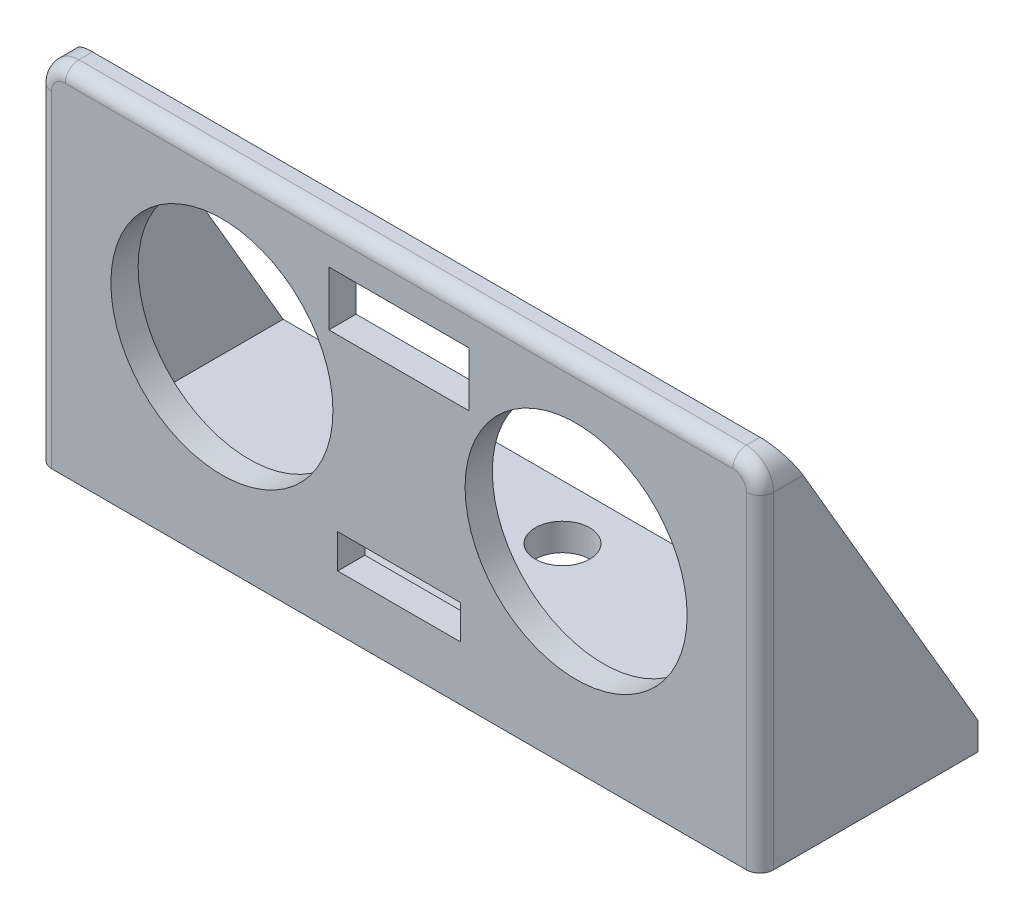
ISO-10303-21;
HEADER;
FILE_DESCRIPTION(('STEP AP214'),'2;1');
FILE_NAME('part.step','',(''),(''),'','','');
FILE_SCHEMA(('AUTOMOTIVE_DESIGN { 1 0 10303 214 1 1 1 1 }'));
ENDSEC;
DATA;
#1=APPLICATION_CONTEXT('core data for automotive mechanical design processes');
#2=APPLICATION_PROTOCOL_DEFINITION('international standard','automotive_design',2000,#1);
#3=PRODUCT_CONTEXT('',#1,'mechanical');
#4=PRODUCT('Part','Part','',(#3));
#5=PRODUCT_RELATED_PRODUCT_CATEGORY('part','',(#4));
#6=PRODUCT_DEFINITION_FORMATION('','',#4);
#7=PRODUCT_DEFINITION_CONTEXT('part definition',#1,'design');
#8=PRODUCT_DEFINITION('design','',#6,#7);
#9=PRODUCT_DEFINITION_SHAPE('','',#8);
#10=(LENGTH_UNIT() NAMED_UNIT(*) SI_UNIT(.MILLI.,.METRE.));
#11=(NAMED_UNIT(*) PLANE_ANGLE_UNIT() SI_UNIT($,.RADIAN.));
#12=(NAMED_UNIT(*) SI_UNIT($,.STERADIAN.) SOLID_ANGLE_UNIT());
#13=UNCERTAINTY_MEASURE_WITH_UNIT(LENGTH_MEASURE(1.E-05),#10,'distance_accuracy_value','');
#14=(GEOMETRIC_REPRESENTATION_CONTEXT(3) GLOBAL_UNCERTAINTY_ASSIGNED_CONTEXT((#13)) GLOBAL_UNIT_ASSIGNED_CONTEXT((#10,
#11,#12)) REPRESENTATION_CONTEXT('',''));
#15=CARTESIAN_POINT('',(0.,0.,0.));
#16=DIRECTION('',(0.,0.,1.));
#17=DIRECTION('',(1.,0.,0.));
#18=AXIS2_PLACEMENT_3D('',#15,#16,#17);
#19=CARTESIAN_POINT('',(0.,0.,2.));
#20=DIRECTION('',(0.,0.,-1.));
#21=DIRECTION('',(-1.,0.,0.));
#22=AXIS2_PLACEMENT_3D('',#19,#20,#21);
#23=PLANE('',#22);
#24=DIRECTION('',(1.,0.,0.));
#25=VECTOR('',#24,1.);
#26=CARTESIAN_POINT('',(0.,-2.,2.));
#27=LINE('',#26,#25);
#28=CARTESIAN_POINT('',(1.,-2.,2.));
#29=VERTEX_POINT('',#28);
#30=CARTESIAN_POINT('',(52.,-2.,2.));
#31=VERTEX_POINT('',#30);
#32=EDGE_CURVE('E198',#29,#31,#27,.T.);
#33=ORIENTED_EDGE('',*,*,#32,.T.);
#34=DIRECTION('',(0.,1.,0.));
#35=VECTOR('',#34,1.);
#36=CARTESIAN_POINT('',(52.,0.,2.));
#37=LINE('',#36,#35);
#38=CARTESIAN_POINT('',(52.,22.,2.));
#39=VERTEX_POINT('',#38);
#40=EDGE_CURVE('E406',#31,#39,#37,.T.);
#41=ORIENTED_EDGE('',*,*,#40,.T.);
#42=CARTESIAN_POINT('',(51.,22.,2.));
#43=DIRECTION('',(0.,0.,-1.));
#44=DIRECTION('',(-1.,0.,0.));
#45=AXIS2_PLACEMENT_3D('',#42,#43,#44);
#46=CIRCLE('',#45,1.);
#47=CARTESIAN_POINT('',(51.,23.,2.));
#48=VERTEX_POINT('',#47);
#49=EDGE_CURVE('E403',#39,#48,#46,.F.);
#50=ORIENTED_EDGE('',*,*,#49,.T.);
#51=DIRECTION('',(-1.,0.,0.));
#52=VECTOR('',#51,1.);
#53=CARTESIAN_POINT('',(0.,23.,2.));
#54=LINE('',#53,#52);
#55=CARTESIAN_POINT('',(2.,23.,2.));
#56=VERTEX_POINT('',#55);
#57=EDGE_CURVE('E394',#48,#56,#54,.T.);
#58=ORIENTED_EDGE('',*,*,#57,.T.);
#59=CARTESIAN_POINT('',(2.,22.,2.));
#60=DIRECTION('',(0.,0.,-1.));
#61=DIRECTION('',(-1.,0.,0.));
#62=AXIS2_PLACEMENT_3D('',#59,#60,#61);
#63=CIRCLE('',#62,1.);
#64=CARTESIAN_POINT('',(1.,22.,2.));
#65=VERTEX_POINT('',#64);
#66=EDGE_CURVE('E397',#56,#65,#63,.F.);
#67=ORIENTED_EDGE('',*,*,#66,.T.);
#68=DIRECTION('',(0.,-1.,0.));
#69=VECTOR('',#68,1.);
#70=CARTESIAN_POINT('',(1.,0.,2.));
#71=LINE('',#70,#69);
#72=EDGE_CURVE('E400',#65,#29,#71,.T.);
#73=ORIENTED_EDGE('',*,*,#72,.T.);
#74=EDGE_LOOP('',(#33,#41,#50,#58,#67,#73));
#75=FACE_BOUND('',#74,.T.);
#76=DIRECTION('',(0.,-1.,0.));
#77=VECTOR('',#76,1.);
#78=CARTESIAN_POINT('',(21.35,21.,2.));
#79=LINE('',#78,#77);
#80=CARTESIAN_POINT('',(21.35,21.,2.));
#81=VERTEX_POINT('',#80);
#82=CARTESIAN_POINT('',(21.35,17.,2.));
#83=VERTEX_POINT('',#82);
#84=EDGE_CURVE('E311',#81,#83,#79,.T.);
#85=ORIENTED_EDGE('',*,*,#84,.F.);
#86=DIRECTION('',(-1.,0.,0.));
#87=VECTOR('',#86,1.);
#88=CARTESIAN_POINT('',(21.35,21.,2.));
#89=LINE('',#88,#87);
#90=CARTESIAN_POINT('',(31.65,21.,2.));
#91=VERTEX_POINT('',#90);
#92=EDGE_CURVE('E322',#91,#81,#89,.T.);
#93=ORIENTED_EDGE('',*,*,#92,.F.);
#94=DIRECTION('',(0.,1.,0.));
#95=VECTOR('',#94,1.);
#96=CARTESIAN_POINT('',(31.65,21.,2.));
#97=LINE('',#96,#95);
#98=CARTESIAN_POINT('',(31.65,17.,2.));
#99=VERTEX_POINT('',#98);
#100=EDGE_CURVE('E318',#99,#91,#97,.T.);
#101=ORIENTED_EDGE('',*,*,#100,.F.);
#102=DIRECTION('',(1.,0.,0.));
#103=VECTOR('',#102,1.);
#104=CARTESIAN_POINT('',(21.35,17.,2.));
#105=LINE('',#104,#103);
#106=EDGE_CURVE('E314',#83,#99,#105,.T.);
#107=ORIENTED_EDGE('',*,*,#106,.F.);
#108=EDGE_LOOP('',(#85,#93,#101,#107));
#109=FACE_BOUND('',#108,.T.);
#110=CARTESIAN_POINT('',(13.5,12.,2.));
#111=DIRECTION('',(0.,0.,1.));
#112=DIRECTION('',(1.,0.,0.));
#113=AXIS2_PLACEMENT_3D('',#110,#111,#112);
#114=CIRCLE('',#113,8.14999999999999);
#115=CARTESIAN_POINT('',(21.65,12.,2.));
#116=VERTEX_POINT('',#115);
#117=EDGE_CURVE('E362',#116,#116,#114,.T.);
#118=ORIENTED_EDGE('',*,*,#117,.F.);
#119=EDGE_LOOP('',(#118));
#120=FACE_BOUND('',#119,.T.);
#121=CARTESIAN_POINT('',(39.5,12.,2.));
#122=DIRECTION('',(0.,0.,1.));
#123=DIRECTION('',(1.,0.,0.));
#124=AXIS2_PLACEMENT_3D('',#121,#122,#123);
#125=CIRCLE('',#124,8.15);
#126=CARTESIAN_POINT('',(47.65,12.,2.));
#127=VERTEX_POINT('',#126);
#128=EDGE_CURVE('E354',#127,#127,#125,.T.);
#129=ORIENTED_EDGE('',*,*,#128,.F.);
#130=EDGE_LOOP('',(#129));
#131=FACE_BOUND('',#130,.T.);
#132=DIRECTION('',(0.,-1.,0.));
#133=VECTOR('',#132,1.);
#134=CARTESIAN_POINT('',(22.,4.5,2.));
#135=LINE('',#134,#133);
#136=CARTESIAN_POINT('',(22.,4.5,2.));
#137=VERTEX_POINT('',#136);
#138=CARTESIAN_POINT('',(22.,2.,2.));
#139=VERTEX_POINT('',#138);
#140=EDGE_CURVE('E268',#137,#139,#135,.T.);
#141=ORIENTED_EDGE('',*,*,#140,.F.);
#142=DIRECTION('',(-1.,0.,0.));
#143=VECTOR('',#142,1.);
#144=CARTESIAN_POINT('',(22.,4.5,2.));
#145=LINE('',#144,#143);
#146=CARTESIAN_POINT('',(31.,4.5,2.));
#147=VERTEX_POINT('',#146);
#148=EDGE_CURVE('E279',#147,#137,#145,.T.);
#149=ORIENTED_EDGE('',*,*,#148,.F.);
#150=DIRECTION('',(0.,1.,0.));
#151=VECTOR('',#150,1.);
#152=CARTESIAN_POINT('',(31.,4.5,2.));
#153=LINE('',#152,#151);
#154=CARTESIAN_POINT('',(31.,2.,2.));
#155=VERTEX_POINT('',#154);
#156=EDGE_CURVE('E275',#155,#147,#153,.T.);
#157=ORIENTED_EDGE('',*,*,#156,.F.);
#158=DIRECTION('',(1.,0.,0.));
#159=VECTOR('',#158,1.);
#160=CARTESIAN_POINT('',(22.,2.,2.));
#161=LINE('',#160,#159);
#162=EDGE_CURVE('E271',#139,#155,#161,.T.);
#163=ORIENTED_EDGE('',*,*,#162,.F.);
#164=EDGE_LOOP('',(#141,#149,#157,#163));
#165=FACE_BOUND('',#164,.T.);
#166=ADVANCED_FACE('F49',(#75,#109,#120,#131,#165),#23,.F.);
#167=CARTESIAN_POINT('',(0.,0.,0.));
#168=DIRECTION('',(0.,0.,-1.));
#169=DIRECTION('',(-1.,0.,0.));
#170=AXIS2_PLACEMENT_3D('',#167,#168,#169);
#171=PLANE('',#170);
#172=DIRECTION('',(0.,-1.,0.));
#173=VECTOR('',#172,1.);
#174=CARTESIAN_POINT('',(2.,0.,0.));
#175=LINE('',#174,#173);
#176=CARTESIAN_POINT('',(2.,24.,0.));
#177=VERTEX_POINT('',#176);
#178=CARTESIAN_POINT('',(2.,0.,0.));
#179=VERTEX_POINT('',#178);
#180=EDGE_CURVE('E227',#177,#179,#175,.T.);
#181=ORIENTED_EDGE('',*,*,#180,.F.);
#182=DIRECTION('',(-1.,0.,0.));
#183=VECTOR('',#182,1.);
#184=CARTESIAN_POINT('',(0.,24.,0.));
#185=LINE('',#184,#183);
#186=CARTESIAN_POINT('',(51.,24.,0.));
#187=VERTEX_POINT('',#186);
#188=EDGE_CURVE('E372',#187,#177,#185,.T.);
#189=ORIENTED_EDGE('',*,*,#188,.F.);
#190=DIRECTION('',(0.,1.,0.));
#191=VECTOR('',#190,1.);
#192=CARTESIAN_POINT('',(51.,0.,0.));
#193=LINE('',#192,#191);
#194=CARTESIAN_POINT('',(51.,0.,0.));
#195=VERTEX_POINT('',#194);
#196=EDGE_CURVE('E243',#195,#187,#193,.T.);
#197=ORIENTED_EDGE('',*,*,#196,.F.);
#198=DIRECTION('',(1.,0.,0.));
#199=VECTOR('',#198,1.);
#200=CARTESIAN_POINT('',(0.,0.,0.));
#201=LINE('',#200,#199);
#202=EDGE_CURVE('E366',#179,#195,#201,.T.);
#203=ORIENTED_EDGE('',*,*,#202,.F.);
#204=EDGE_LOOP('',(#181,#189,#197,#203));
#205=FACE_BOUND('',#204,.T.);
#206=CARTESIAN_POINT('',(13.5,12.,0.));
#207=DIRECTION('',(0.,0.,1.));
#208=DIRECTION('',(1.,0.,0.));
#209=AXIS2_PLACEMENT_3D('',#206,#207,#208);
#210=CIRCLE('',#209,8.14999999999999);
#211=CARTESIAN_POINT('',(21.65,12.,0.));
#212=VERTEX_POINT('',#211);
#213=EDGE_CURVE('E358',#212,#212,#210,.T.);
#214=ORIENTED_EDGE('',*,*,#213,.T.);
#215=EDGE_LOOP('',(#214));
#216=FACE_BOUND('',#215,.T.);
#217=CARTESIAN_POINT('',(39.5,12.,0.));
#218=DIRECTION('',(0.,0.,1.));
#219=DIRECTION('',(1.,0.,0.));
#220=AXIS2_PLACEMENT_3D('',#217,#218,#219);
#221=CIRCLE('',#220,8.15);
#222=CARTESIAN_POINT('',(47.65,12.,0.));
#223=VERTEX_POINT('',#222);
#224=EDGE_CURVE('E353',#223,#223,#221,.T.);
#225=ORIENTED_EDGE('',*,*,#224,.T.);
#226=EDGE_LOOP('',(#225));
#227=FACE_BOUND('',#226,.T.);
#228=DIRECTION('',(-1.,0.,0.));
#229=VECTOR('',#228,1.);
#230=CARTESIAN_POINT('',(21.35,21.,0.));
#231=LINE('',#230,#229);
#232=CARTESIAN_POINT('',(31.65,21.,0.));
#233=VERTEX_POINT('',#232);
#234=CARTESIAN_POINT('',(21.35,21.,0.));
#235=VERTEX_POINT('',#234);
#236=EDGE_CURVE('E315',#233,#235,#231,.T.);
#237=ORIENTED_EDGE('',*,*,#236,.T.);
#238=DIRECTION('',(0.,-1.,0.));
#239=VECTOR('',#238,1.);
#240=CARTESIAN_POINT('',(21.35,21.,0.));
#241=LINE('',#240,#239);
#242=CARTESIAN_POINT('',(21.35,17.,0.));
#243=VERTEX_POINT('',#242);
#244=EDGE_CURVE('E310',#235,#243,#241,.T.);
#245=ORIENTED_EDGE('',*,*,#244,.T.);
#246=DIRECTION('',(1.,0.,0.));
#247=VECTOR('',#246,1.);
#248=CARTESIAN_POINT('',(21.35,17.,0.));
#249=LINE('',#248,#247);
#250=CARTESIAN_POINT('',(31.65,17.,0.));
#251=VERTEX_POINT('',#250);
#252=EDGE_CURVE('E329',#243,#251,#249,.T.);
#253=ORIENTED_EDGE('',*,*,#252,.T.);
#254=DIRECTION('',(0.,1.,0.));
#255=VECTOR('',#254,1.);
#256=CARTESIAN_POINT('',(31.65,21.,0.));
#257=LINE('',#256,#255);
#258=EDGE_CURVE('E333',#251,#233,#257,.T.);
#259=ORIENTED_EDGE('',*,*,#258,.T.);
#260=EDGE_LOOP('',(#237,#245,#253,#259));
#261=FACE_BOUND('',#260,.T.);
#262=DIRECTION('',(-1.,0.,0.));
#263=VECTOR('',#262,1.);
#264=CARTESIAN_POINT('',(22.,4.5,0.));
#265=LINE('',#264,#263);
#266=CARTESIAN_POINT('',(31.,4.5,0.));
#267=VERTEX_POINT('',#266);
#268=CARTESIAN_POINT('',(22.,4.5,0.));
#269=VERTEX_POINT('',#268);
#270=EDGE_CURVE('E272',#267,#269,#265,.T.);
#271=ORIENTED_EDGE('',*,*,#270,.T.);
#272=DIRECTION('',(0.,-1.,0.));
#273=VECTOR('',#272,1.);
#274=CARTESIAN_POINT('',(22.,4.5,0.));
#275=LINE('',#274,#273);
#276=CARTESIAN_POINT('',(22.,2.,0.));
#277=VERTEX_POINT('',#276);
#278=EDGE_CURVE('E265',#269,#277,#275,.T.);
#279=ORIENTED_EDGE('',*,*,#278,.T.);
#280=DIRECTION('',(1.,0.,0.));
#281=VECTOR('',#280,1.);
#282=CARTESIAN_POINT('',(22.,2.,0.));
#283=LINE('',#282,#281);
#284=CARTESIAN_POINT('',(31.,2.,0.));
#285=VERTEX_POINT('',#284);
#286=EDGE_CURVE('E286',#277,#285,#283,.T.);
#287=ORIENTED_EDGE('',*,*,#286,.T.);
#288=DIRECTION('',(0.,1.,0.));
#289=VECTOR('',#288,1.);
#290=CARTESIAN_POINT('',(31.,4.5,0.));
#291=LINE('',#290,#289);
#292=EDGE_CURVE('E290',#285,#267,#291,.T.);
#293=ORIENTED_EDGE('',*,*,#292,.T.);
#294=EDGE_LOOP('',(#271,#279,#287,#293));
#295=FACE_BOUND('',#294,.T.);
#296=ADVANCED_FACE('F484',(#205,#216,#227,#261,#295),#171,.T.);
#297=CARTESIAN_POINT('',(0.,0.,2.));
#298=DIRECTION('',(1.,0.,0.));
#299=DIRECTION('',(0.,0.,-1.));
#300=AXIS2_PLACEMENT_3D('',#297,#298,#299);
#301=PLANE('',#300);
#302=DIRECTION('',(0.,0.,1.));
#303=VECTOR('',#302,1.);
#304=CARTESIAN_POINT('',(0.,-2.,-14.));
#305=LINE('',#304,#303);
#306=CARTESIAN_POINT('',(0.,-2.,-14.));
#307=VERTEX_POINT('',#306);
#308=CARTESIAN_POINT('',(0.,-2.,0.999999999999999));
#309=VERTEX_POINT('',#308);
#310=EDGE_CURVE('E257',#307,#309,#305,.T.);
#311=ORIENTED_EDGE('',*,*,#310,.T.);
#312=DIRECTION('',(0.,-1.,0.));
#313=VECTOR('',#312,1.);
#314=CARTESIAN_POINT('',(0.,0.,1.));
#315=LINE('',#314,#313);
#316=CARTESIAN_POINT('',(0.,22.,1.));
#317=VERTEX_POINT('',#316);
#318=EDGE_CURVE('E74',#309,#317,#315,.F.);
#319=ORIENTED_EDGE('',*,*,#318,.T.);
#320=DIRECTION('',(0.,0.,-1.));
#321=VECTOR('',#320,1.);
#322=CARTESIAN_POINT('',(0.,22.,2.));
#323=LINE('',#322,#321);
#324=CARTESIAN_POINT('',(0.,22.,-1.16666666666667));
#325=VERTEX_POINT('',#324);
#326=EDGE_CURVE('E211',#317,#325,#323,.T.);
#327=ORIENTED_EDGE('',*,*,#326,.T.);
#328=DIRECTION('',(0.,0.863778900898433,0.503871025524086));
#329=VECTOR('',#328,1.);
#330=CARTESIAN_POINT('',(0.,6.96373056994819,-9.93782383419689));
#331=LINE('',#330,#329);
#332=CARTESIAN_POINT('',(0.,0.,-14.));
#333=VERTEX_POINT('',#332);
#334=EDGE_CURVE('E204',#333,#325,#331,.T.);
#335=ORIENTED_EDGE('',*,*,#334,.F.);
#336=DIRECTION('',(0.,-1.,0.));
#337=VECTOR('',#336,1.);
#338=CARTESIAN_POINT('',(0.,0.,-14.));
#339=LINE('',#338,#337);
#340=EDGE_CURVE('E189',#333,#307,#339,.T.);
#341=ORIENTED_EDGE('',*,*,#340,.T.);
#342=EDGE_LOOP('',(#311,#319,#327,#335,#341));
#343=FACE_BOUND('',#342,.T.);
#344=ADVANCED_FACE('F210',(#343),#301,.F.);
#345=CARTESIAN_POINT('',(53.,0.,2.));
#346=DIRECTION('',(-1.,0.,0.));
#347=DIRECTION('',(0.,0.,1.));
#348=AXIS2_PLACEMENT_3D('',#345,#346,#347);
#349=PLANE('',#348);
#350=DIRECTION('',(0.,0.,-1.));
#351=VECTOR('',#350,1.);
#352=CARTESIAN_POINT('',(53.,22.,2.));
#353=LINE('',#352,#351);
#354=CARTESIAN_POINT('',(53.,22.,-1.16666666666667));
#355=VERTEX_POINT('',#354);
#356=CARTESIAN_POINT('',(53.,22.,1.));
#357=VERTEX_POINT('',#356);
#358=EDGE_CURVE('E390',#355,#357,#353,.F.);
#359=ORIENTED_EDGE('',*,*,#358,.T.);
#360=DIRECTION('',(0.,1.,0.));
#361=VECTOR('',#360,1.);
#362=CARTESIAN_POINT('',(53.,0.,1.));
#363=LINE('',#362,#361);
#364=CARTESIAN_POINT('',(53.,-2.,0.999999999999999));
#365=VERTEX_POINT('',#364);
#366=EDGE_CURVE('E410',#357,#365,#363,.F.);
#367=ORIENTED_EDGE('',*,*,#366,.T.);
#368=DIRECTION('',(0.,0.,1.));
#369=VECTOR('',#368,1.);
#370=CARTESIAN_POINT('',(53.,-2.,-14.));
#371=LINE('',#370,#369);
#372=CARTESIAN_POINT('',(53.,-2.,-14.));
#373=VERTEX_POINT('',#372);
#374=EDGE_CURVE('E261',#373,#365,#371,.T.);
#375=ORIENTED_EDGE('',*,*,#374,.F.);
#376=DIRECTION('',(0.,1.,0.));
#377=VECTOR('',#376,1.);
#378=CARTESIAN_POINT('',(53.,0.,-14.));
#379=LINE('',#378,#377);
#380=CARTESIAN_POINT('',(53.,0.,-14.));
#381=VERTEX_POINT('',#380);
#382=EDGE_CURVE('E249',#373,#381,#379,.T.);
#383=ORIENTED_EDGE('',*,*,#382,.T.);
#384=DIRECTION('',(0.,0.863778900898433,0.503871025524086));
#385=VECTOR('',#384,1.);
#386=CARTESIAN_POINT('',(53.,24.,0.));
#387=LINE('',#386,#385);
#388=EDGE_CURVE('E231',#381,#355,#387,.T.);
#389=ORIENTED_EDGE('',*,*,#388,.T.);
#390=EDGE_LOOP('',(#359,#367,#375,#383,#389));
#391=FACE_BOUND('',#390,.T.);
#392=ADVANCED_FACE('F506',(#391),#349,.F.);
#393=CARTESIAN_POINT('',(0.,24.,2.));
#394=DIRECTION('',(0.,-1.,0.));
#395=DIRECTION('',(0.,0.,-1.));
#396=AXIS2_PLACEMENT_3D('',#393,#394,#395);
#397=PLANE('',#396);
#398=DIRECTION('',(0.,0.,-1.));
#399=VECTOR('',#398,1.);
#400=CARTESIAN_POINT('',(2.,24.,2.));
#401=LINE('',#400,#399);
#402=CARTESIAN_POINT('',(2.,24.,1.));
#403=VERTEX_POINT('',#402);
#404=EDGE_CURVE('E384',#177,#403,#401,.F.);
#405=ORIENTED_EDGE('',*,*,#404,.T.);
#406=DIRECTION('',(-1.,0.,0.));
#407=VECTOR('',#406,1.);
#408=CARTESIAN_POINT('',(0.,24.,1.));
#409=LINE('',#408,#407);
#410=CARTESIAN_POINT('',(51.,24.,1.));
#411=VERTEX_POINT('',#410);
#412=EDGE_CURVE('E11',#403,#411,#409,.F.);
#413=ORIENTED_EDGE('',*,*,#412,.T.);
#414=DIRECTION('',(0.,0.,-1.));
#415=VECTOR('',#414,1.);
#416=CARTESIAN_POINT('',(51.,24.,2.));
#417=LINE('',#416,#415);
#418=EDGE_CURVE('E381',#411,#187,#417,.T.);
#419=ORIENTED_EDGE('',*,*,#418,.T.);
#420=ORIENTED_EDGE('',*,*,#188,.T.);
#421=EDGE_LOOP('',(#405,#413,#419,#420));
#422=FACE_BOUND('',#421,.T.);
#423=ADVANCED_FACE('F490',(#422),#397,.F.);
#424=CARTESIAN_POINT('',(13.5,12.,2.));
#425=DIRECTION('',(0.,0.,-1.));
#426=DIRECTION('',(-1.,0.,0.));
#427=AXIS2_PLACEMENT_3D('',#424,#425,#426);
#428=CYLINDRICAL_SURFACE('',#427,8.14999999999999);
#429=ORIENTED_EDGE('',*,*,#117,.T.);
#430=EDGE_LOOP('',(#429));
#431=FACE_BOUND('',#430,.T.);
#432=ORIENTED_EDGE('',*,*,#213,.F.);
#433=EDGE_LOOP('',(#432));
#434=FACE_BOUND('',#433,.T.);
#435=ADVANCED_FACE('F543',(#431,#434),#428,.F.);
#436=CARTESIAN_POINT('',(39.5,12.,2.));
#437=DIRECTION('',(0.,0.,-1.));
#438=DIRECTION('',(-1.,0.,0.));
#439=AXIS2_PLACEMENT_3D('',#436,#437,#438);
#440=CYLINDRICAL_SURFACE('',#439,8.15);
#441=ORIENTED_EDGE('',*,*,#128,.T.);
#442=EDGE_LOOP('',(#441));
#443=FACE_BOUND('',#442,.T.);
#444=ORIENTED_EDGE('',*,*,#224,.F.);
#445=EDGE_LOOP('',(#444));
#446=FACE_BOUND('',#445,.T.);
#447=ADVANCED_FACE('F746',(#443,#446),#440,.F.);
#448=CARTESIAN_POINT('',(21.35,21.,2.));
#449=DIRECTION('',(1.,0.,0.));
#450=DIRECTION('',(0.,0.,-1.));
#451=AXIS2_PLACEMENT_3D('',#448,#449,#450);
#452=PLANE('',#451);
#453=ORIENTED_EDGE('',*,*,#244,.F.);
#454=DIRECTION('',(0.,0.,-1.));
#455=VECTOR('',#454,1.);
#456=CARTESIAN_POINT('',(21.35,21.,2.));
#457=LINE('',#456,#455);
#458=EDGE_CURVE('E325',#81,#235,#457,.T.);
#459=ORIENTED_EDGE('',*,*,#458,.F.);
#460=ORIENTED_EDGE('',*,*,#84,.T.);
#461=DIRECTION('',(0.,0.,-1.));
#462=VECTOR('',#461,1.);
#463=CARTESIAN_POINT('',(21.35,17.,2.));
#464=LINE('',#463,#462);
#465=EDGE_CURVE('E349',#83,#243,#464,.T.);
#466=ORIENTED_EDGE('',*,*,#465,.T.);
#467=EDGE_LOOP('',(#453,#459,#460,#466));
#468=FACE_BOUND('',#467,.T.);
#469=ADVANCED_FACE('F737',(#468),#452,.T.);
#470=CARTESIAN_POINT('',(21.35,17.,2.));
#471=DIRECTION('',(0.,1.,0.));
#472=DIRECTION('',(0.,0.,1.));
#473=AXIS2_PLACEMENT_3D('',#470,#471,#472);
#474=PLANE('',#473);
#475=ORIENTED_EDGE('',*,*,#252,.F.);
#476=ORIENTED_EDGE('',*,*,#465,.F.);
#477=ORIENTED_EDGE('',*,*,#106,.T.);
#478=DIRECTION('',(0.,0.,-1.));
#479=VECTOR('',#478,1.);
#480=CARTESIAN_POINT('',(31.65,17.,2.));
#481=LINE('',#480,#479);
#482=EDGE_CURVE('E346',#99,#251,#481,.T.);
#483=ORIENTED_EDGE('',*,*,#482,.T.);
#484=EDGE_LOOP('',(#475,#476,#477,#483));
#485=FACE_BOUND('',#484,.T.);
#486=ADVANCED_FACE('F728',(#485),#474,.T.);
#487=CARTESIAN_POINT('',(31.65,21.,2.));
#488=DIRECTION('',(-1.,0.,0.));
#489=DIRECTION('',(0.,0.,1.));
#490=AXIS2_PLACEMENT_3D('',#487,#488,#489);
#491=PLANE('',#490);
#492=ORIENTED_EDGE('',*,*,#258,.F.);
#493=ORIENTED_EDGE('',*,*,#482,.F.);
#494=ORIENTED_EDGE('',*,*,#100,.T.);
#495=DIRECTION('',(0.,0.,-1.));
#496=VECTOR('',#495,1.);
#497=CARTESIAN_POINT('',(31.65,21.,2.));
#498=LINE('',#497,#496);
#499=EDGE_CURVE('E343',#91,#233,#498,.T.);
#500=ORIENTED_EDGE('',*,*,#499,.T.);
#501=EDGE_LOOP('',(#492,#493,#494,#500));
#502=FACE_BOUND('',#501,.T.);
#503=ADVANCED_FACE('F719',(#502),#491,.T.);
#504=CARTESIAN_POINT('',(21.35,21.,2.));
#505=DIRECTION('',(0.,-1.,0.));
#506=DIRECTION('',(0.,0.,-1.));
#507=AXIS2_PLACEMENT_3D('',#504,#505,#506);
#508=PLANE('',#507);
#509=ORIENTED_EDGE('',*,*,#236,.F.);
#510=ORIENTED_EDGE('',*,*,#499,.F.);
#511=ORIENTED_EDGE('',*,*,#92,.T.);
#512=ORIENTED_EDGE('',*,*,#458,.T.);
#513=EDGE_LOOP('',(#509,#510,#511,#512));
#514=FACE_BOUND('',#513,.T.);
#515=ADVANCED_FACE('F710',(#514),#508,.T.);
#516=CARTESIAN_POINT('',(22.,4.5,2.));
#517=DIRECTION('',(1.,0.,0.));
#518=DIRECTION('',(0.,0.,-1.));
#519=AXIS2_PLACEMENT_3D('',#516,#517,#518);
#520=PLANE('',#519);
#521=ORIENTED_EDGE('',*,*,#278,.F.);
#522=DIRECTION('',(0.,0.,-1.));
#523=VECTOR('',#522,1.);
#524=CARTESIAN_POINT('',(22.,4.5,2.));
#525=LINE('',#524,#523);
#526=EDGE_CURVE('E282',#137,#269,#525,.T.);
#527=ORIENTED_EDGE('',*,*,#526,.F.);
#528=ORIENTED_EDGE('',*,*,#140,.T.);
#529=DIRECTION('',(0.,0.,-1.));
#530=VECTOR('',#529,1.);
#531=CARTESIAN_POINT('',(22.,2.,2.));
#532=LINE('',#531,#530);
#533=EDGE_CURVE('E306',#139,#277,#532,.T.);
#534=ORIENTED_EDGE('',*,*,#533,.T.);
#535=EDGE_LOOP('',(#521,#527,#528,#534));
#536=FACE_BOUND('',#535,.T.);
#537=ADVANCED_FACE('F701',(#536),#520,.T.);
#538=CARTESIAN_POINT('',(22.,2.,2.));
#539=DIRECTION('',(0.,1.,0.));
#540=DIRECTION('',(0.,0.,1.));
#541=AXIS2_PLACEMENT_3D('',#538,#539,#540);
#542=PLANE('',#541);
#543=ORIENTED_EDGE('',*,*,#286,.F.);
#544=ORIENTED_EDGE('',*,*,#533,.F.);
#545=ORIENTED_EDGE('',*,*,#162,.T.);
#546=DIRECTION('',(0.,0.,-1.));
#547=VECTOR('',#546,1.);
#548=CARTESIAN_POINT('',(31.,2.,2.));
#549=LINE('',#548,#547);
#550=EDGE_CURVE('E303',#155,#285,#549,.T.);
#551=ORIENTED_EDGE('',*,*,#550,.T.);
#552=EDGE_LOOP('',(#543,#544,#545,#551));
#553=FACE_BOUND('',#552,.T.);
#554=ADVANCED_FACE('F692',(#553),#542,.T.);
#555=CARTESIAN_POINT('',(31.,4.5,2.));
#556=DIRECTION('',(-1.,0.,0.));
#557=DIRECTION('',(0.,0.,1.));
#558=AXIS2_PLACEMENT_3D('',#555,#556,#557);
#559=PLANE('',#558);
#560=ORIENTED_EDGE('',*,*,#292,.F.);
#561=ORIENTED_EDGE('',*,*,#550,.F.);
#562=ORIENTED_EDGE('',*,*,#156,.T.);
#563=DIRECTION('',(0.,0.,-1.));
#564=VECTOR('',#563,1.);
#565=CARTESIAN_POINT('',(31.,4.5,2.));
#566=LINE('',#565,#564);
#567=EDGE_CURVE('E300',#147,#267,#566,.T.);
#568=ORIENTED_EDGE('',*,*,#567,.T.);
#569=EDGE_LOOP('',(#560,#561,#562,#568));
#570=FACE_BOUND('',#569,.T.);
#571=ADVANCED_FACE('F683',(#570),#559,.T.);
#572=CARTESIAN_POINT('',(22.,4.5,2.));
#573=DIRECTION('',(0.,-1.,0.));
#574=DIRECTION('',(0.,0.,-1.));
#575=AXIS2_PLACEMENT_3D('',#572,#573,#574);
#576=PLANE('',#575);
#577=ORIENTED_EDGE('',*,*,#270,.F.);
#578=ORIENTED_EDGE('',*,*,#567,.F.);
#579=ORIENTED_EDGE('',*,*,#148,.T.);
#580=ORIENTED_EDGE('',*,*,#526,.T.);
#581=EDGE_LOOP('',(#577,#578,#579,#580));
#582=FACE_BOUND('',#581,.T.);
#583=ADVANCED_FACE('F472',(#582),#576,.T.);
#584=CARTESIAN_POINT('',(0.,0.,-14.));
#585=DIRECTION('',(0.,1.,0.));
#586=DIRECTION('',(0.,0.,1.));
#587=AXIS2_PLACEMENT_3D('',#584,#585,#586);
#588=PLANE('',#587);
#589=CARTESIAN_POINT('',(12.9,0.,-10.));
#590=DIRECTION('',(0.,1.,0.));
#591=DIRECTION('',(0.,0.,1.));
#592=AXIS2_PLACEMENT_3D('',#589,#590,#591);
#593=CIRCLE('',#592,1.65);
#594=CARTESIAN_POINT('',(12.9,0.,-8.35));
#595=VERTEX_POINT('',#594);
#596=EDGE_CURVE('E220',#595,#595,#593,.T.);
#597=ORIENTED_EDGE('',*,*,#596,.F.);
#598=EDGE_LOOP('',(#597));
#599=FACE_BOUND('',#598,.T.);
#600=CARTESIAN_POINT('',(40.1,0.,-10.));
#601=DIRECTION('',(0.,1.,0.));
#602=DIRECTION('',(0.,0.,1.));
#603=AXIS2_PLACEMENT_3D('',#600,#601,#602);
#604=CIRCLE('',#603,1.65);
#605=CARTESIAN_POINT('',(40.1,0.,-8.35));
#606=VERTEX_POINT('',#605);
#607=EDGE_CURVE('E458',#606,#606,#604,.T.);
#608=ORIENTED_EDGE('',*,*,#607,.F.);
#609=EDGE_LOOP('',(#608));
#610=FACE_BOUND('',#609,.T.);
#611=CARTESIAN_POINT('',(26.5,0.,-10.));
#612=DIRECTION('',(0.,1.,0.));
#613=DIRECTION('',(0.,0.,1.));
#614=AXIS2_PLACEMENT_3D('',#611,#612,#613);
#615=CIRCLE('',#614,2.);
#616=CARTESIAN_POINT('',(26.5,0.,-8.));
#617=VERTEX_POINT('',#616);
#618=EDGE_CURVE('E447',#617,#617,#615,.T.);
#619=ORIENTED_EDGE('',*,*,#618,.F.);
#620=EDGE_LOOP('',(#619));
#621=FACE_BOUND('',#620,.T.);
#622=DIRECTION('',(0.,0.,-1.));
#623=VECTOR('',#622,1.);
#624=CARTESIAN_POINT('',(2.,0.,-14.));
#625=LINE('',#624,#623);
#626=CARTESIAN_POINT('',(2.,0.,-14.));
#627=VERTEX_POINT('',#626);
#628=EDGE_CURVE('E208',#179,#627,#625,.T.);
#629=ORIENTED_EDGE('',*,*,#628,.F.);
#630=ORIENTED_EDGE('',*,*,#202,.T.);
#631=DIRECTION('',(0.,0.,1.));
#632=VECTOR('',#631,1.);
#633=CARTESIAN_POINT('',(51.,0.,-14.));
#634=LINE('',#633,#632);
#635=CARTESIAN_POINT('',(51.,0.,-14.));
#636=VERTEX_POINT('',#635);
#637=EDGE_CURVE('E236',#636,#195,#634,.T.);
#638=ORIENTED_EDGE('',*,*,#637,.F.);
#639=DIRECTION('',(-1.,0.,0.));
#640=VECTOR('',#639,1.);
#641=CARTESIAN_POINT('',(0.,0.,-14.));
#642=LINE('',#641,#640);
#643=EDGE_CURVE('E252',#636,#627,#642,.T.);
#644=ORIENTED_EDGE('',*,*,#643,.T.);
#645=EDGE_LOOP('',(#629,#630,#638,#644));
#646=FACE_BOUND('',#645,.T.);
#647=ADVANCED_FACE('F468',(#599,#610,#621,#646),#588,.T.);
#648=CARTESIAN_POINT('',(0.,-2.,-14.));
#649=DIRECTION('',(0.,-1.,0.));
#650=DIRECTION('',(0.,0.,-1.));
#651=AXIS2_PLACEMENT_3D('',#648,#649,#650);
#652=PLANE('',#651);
#653=CARTESIAN_POINT('',(12.9,-2.,-10.));
#654=DIRECTION('',(0.,1.,0.));
#655=DIRECTION('',(0.,0.,1.));
#656=AXIS2_PLACEMENT_3D('',#653,#654,#655);
#657=CIRCLE('',#656,1.65);
#658=CARTESIAN_POINT('',(12.9,-2.,-8.35));
#659=VERTEX_POINT('',#658);
#660=EDGE_CURVE('E214',#659,#659,#657,.T.);
#661=ORIENTED_EDGE('',*,*,#660,.T.);
#662=EDGE_LOOP('',(#661));
#663=FACE_BOUND('',#662,.T.);
#664=CARTESIAN_POINT('',(40.1,-2.,-10.));
#665=DIRECTION('',(0.,1.,0.));
#666=DIRECTION('',(0.,0.,1.));
#667=AXIS2_PLACEMENT_3D('',#664,#665,#666);
#668=CIRCLE('',#667,1.65);
#669=CARTESIAN_POINT('',(40.1,-2.,-8.35));
#670=VERTEX_POINT('',#669);
#671=EDGE_CURVE('E452',#670,#670,#668,.T.);
#672=ORIENTED_EDGE('',*,*,#671,.T.);
#673=EDGE_LOOP('',(#672));
#674=FACE_BOUND('',#673,.T.);
#675=CARTESIAN_POINT('',(26.5,-2.,-10.));
#676=DIRECTION('',(0.,1.,0.));
#677=DIRECTION('',(0.,0.,1.));
#678=AXIS2_PLACEMENT_3D('',#675,#676,#677);
#679=CIRCLE('',#678,2.);
#680=CARTESIAN_POINT('',(26.5,-2.,-8.));
#681=VERTEX_POINT('',#680);
#682=EDGE_CURVE('E441',#681,#681,#679,.T.);
#683=ORIENTED_EDGE('',*,*,#682,.T.);
#684=EDGE_LOOP('',(#683));
#685=FACE_BOUND('',#684,.T.);
#686=ORIENTED_EDGE('',*,*,#374,.T.);
#687=CARTESIAN_POINT('',(52.,-2.,1.));
#688=DIRECTION('',(0.,-1.,0.));
#689=DIRECTION('',(0.,0.,-1.));
#690=AXIS2_PLACEMENT_3D('',#687,#688,#689);
#691=CIRCLE('',#690,1.);
#692=EDGE_CURVE('E416',#365,#31,#691,.T.);
#693=ORIENTED_EDGE('',*,*,#692,.T.);
#694=ORIENTED_EDGE('',*,*,#32,.F.);
#695=CARTESIAN_POINT('',(1.,-2.,1.));
#696=DIRECTION('',(0.,-1.,0.));
#697=DIRECTION('',(0.,0.,-1.));
#698=AXIS2_PLACEMENT_3D('',#695,#696,#697);
#699=CIRCLE('',#698,1.);
#700=EDGE_CURVE('E413',#29,#309,#699,.T.);
#701=ORIENTED_EDGE('',*,*,#700,.T.);
#702=ORIENTED_EDGE('',*,*,#310,.F.);
#703=DIRECTION('',(1.,0.,0.));
#704=VECTOR('',#703,1.);
#705=CARTESIAN_POINT('',(0.,-2.,-14.));
#706=LINE('',#705,#704);
#707=EDGE_CURVE('E195',#307,#373,#706,.T.);
#708=ORIENTED_EDGE('',*,*,#707,.T.);
#709=EDGE_LOOP('',(#686,#693,#694,#701,#702,#708));
#710=FACE_BOUND('',#709,.T.);
#711=ADVANCED_FACE('F471',(#663,#674,#685,#710),#652,.T.);
#712=CARTESIAN_POINT('',(0.,0.,-14.));
#713=DIRECTION('',(0.,0.,1.));
#714=DIRECTION('',(1.,0.,0.));
#715=AXIS2_PLACEMENT_3D('',#712,#713,#714);
#716=PLANE('',#715);
#717=ORIENTED_EDGE('',*,*,#382,.F.);
#718=ORIENTED_EDGE('',*,*,#707,.F.);
#719=ORIENTED_EDGE('',*,*,#340,.F.);
#720=DIRECTION('',(-1.,0.,0.));
#721=VECTOR('',#720,1.);
#722=CARTESIAN_POINT('',(2.,0.,-14.));
#723=LINE('',#722,#721);
#724=EDGE_CURVE('E193',#627,#333,#723,.T.);
#725=ORIENTED_EDGE('',*,*,#724,.F.);
#726=ORIENTED_EDGE('',*,*,#643,.F.);
#727=EDGE_CURVE('E253',#381,#636,#642,.T.);
#728=ORIENTED_EDGE('',*,*,#727,.F.);
#729=EDGE_LOOP('',(#717,#718,#719,#725,#726,#728));
#730=FACE_BOUND('',#729,.T.);
#731=ADVANCED_FACE('F192',(#730),#716,.F.);
#732=CARTESIAN_POINT('',(51.,24.,0.));
#733=DIRECTION('',(0.,0.503871025524086,-0.863778900898433));
#734=DIRECTION('',(0.,0.863778900898433,0.503871025524086));
#735=AXIS2_PLACEMENT_3D('',#732,#733,#734);
#736=PLANE('',#735);
#737=DIRECTION('',(0.,0.863778900898433,0.503871025524086));
#738=VECTOR('',#737,1.);
#739=CARTESIAN_POINT('',(51.,24.,0.));
#740=LINE('',#739,#738);
#741=EDGE_CURVE('E232',#636,#187,#740,.T.);
#742=ORIENTED_EDGE('',*,*,#741,.T.);
#743=CARTESIAN_POINT('',(51.,22.,-1.16666666666667));
#744=DIRECTION('',(0.,0.503871025524086,-0.863778900898433));
#745=DIRECTION('',(0.,-0.863778900898433,-0.503871025524086));
#746=AXIS2_PLACEMENT_3D('',#743,#744,#745);
#747=ELLIPSE('',#746,2.31540733157497,2.);
#748=EDGE_CURVE('E387',#187,#355,#747,.T.);
#749=ORIENTED_EDGE('',*,*,#748,.T.);
#750=ORIENTED_EDGE('',*,*,#388,.F.);
#751=ORIENTED_EDGE('',*,*,#727,.T.);
#752=EDGE_LOOP('',(#742,#749,#750,#751));
#753=FACE_BOUND('',#752,.T.);
#754=ADVANCED_FACE('F523',(#753),#736,.T.);
#755=CARTESIAN_POINT('',(51.,0.,0.));
#756=DIRECTION('',(-1.,0.,0.));
#757=DIRECTION('',(0.,0.,1.));
#758=AXIS2_PLACEMENT_3D('',#755,#756,#757);
#759=PLANE('',#758);
#760=ORIENTED_EDGE('',*,*,#637,.T.);
#761=ORIENTED_EDGE('',*,*,#196,.T.);
#762=ORIENTED_EDGE('',*,*,#741,.F.);
#763=EDGE_LOOP('',(#760,#761,#762));
#764=FACE_BOUND('',#763,.T.);
#765=ADVANCED_FACE('F525',(#764),#759,.T.);
#766=CARTESIAN_POINT('',(2.,6.96373056994819,-9.93782383419689));
#767=DIRECTION('',(0.,-0.503871025524086,0.863778900898433));
#768=DIRECTION('',(0.,-0.863778900898433,-0.503871025524086));
#769=AXIS2_PLACEMENT_3D('',#766,#767,#768);
#770=PLANE('',#769);
#771=ORIENTED_EDGE('',*,*,#334,.T.);
#772=CARTESIAN_POINT('',(2.,22.,-1.16666666666667));
#773=DIRECTION('',(0.,-0.503871025524086,0.863778900898433));
#774=DIRECTION('',(0.,-0.863778900898433,-0.503871025524086));
#775=AXIS2_PLACEMENT_3D('',#772,#773,#774);
#776=ELLIPSE('',#775,2.31540733157497,2.);
#777=EDGE_CURVE('E378',#325,#177,#776,.F.);
#778=ORIENTED_EDGE('',*,*,#777,.T.);
#779=DIRECTION('',(0.,0.863778900898433,0.503871025524086));
#780=VECTOR('',#779,1.);
#781=CARTESIAN_POINT('',(2.,6.96373056994819,-9.93782383419689));
#782=LINE('',#781,#780);
#783=EDGE_CURVE('E206',#627,#177,#782,.T.);
#784=ORIENTED_EDGE('',*,*,#783,.F.);
#785=ORIENTED_EDGE('',*,*,#724,.T.);
#786=EDGE_LOOP('',(#771,#778,#784,#785));
#787=FACE_BOUND('',#786,.T.);
#788=ADVANCED_FACE('F203',(#787),#770,.F.);
#789=CARTESIAN_POINT('',(2.,0.,0.));
#790=DIRECTION('',(1.,0.,0.));
#791=DIRECTION('',(0.,0.,-1.));
#792=AXIS2_PLACEMENT_3D('',#789,#790,#791);
#793=PLANE('',#792);
#794=ORIENTED_EDGE('',*,*,#783,.T.);
#795=ORIENTED_EDGE('',*,*,#180,.T.);
#796=ORIENTED_EDGE('',*,*,#628,.T.);
#797=EDGE_LOOP('',(#794,#795,#796));
#798=FACE_BOUND('',#797,.T.);
#799=ADVANCED_FACE('F487',(#798),#793,.T.);
#800=CARTESIAN_POINT('',(26.5,-2.,-10.));
#801=DIRECTION('',(0.,1.,0.));
#802=DIRECTION('',(0.,0.,1.));
#803=AXIS2_PLACEMENT_3D('',#800,#801,#802);
#804=CYLINDRICAL_SURFACE('',#803,2.);
#805=ORIENTED_EDGE('',*,*,#682,.F.);
#806=EDGE_LOOP('',(#805));
#807=FACE_BOUND('',#806,.T.);
#808=ORIENTED_EDGE('',*,*,#618,.T.);
#809=EDGE_LOOP('',(#808));
#810=FACE_BOUND('',#809,.T.);
#811=ADVANCED_FACE('F625',(#807,#810),#804,.F.);
#812=CARTESIAN_POINT('',(40.1,-2.,-10.));
#813=DIRECTION('',(0.,1.,0.));
#814=DIRECTION('',(0.,0.,1.));
#815=AXIS2_PLACEMENT_3D('',#812,#813,#814);
#816=CYLINDRICAL_SURFACE('',#815,1.65);
#817=ORIENTED_EDGE('',*,*,#671,.F.);
#818=EDGE_LOOP('',(#817));
#819=FACE_BOUND('',#818,.T.);
#820=ORIENTED_EDGE('',*,*,#607,.T.);
#821=EDGE_LOOP('',(#820));
#822=FACE_BOUND('',#821,.T.);
#823=ADVANCED_FACE('F634',(#819,#822),#816,.F.);
#824=CARTESIAN_POINT('',(12.9,-2.,-10.));
#825=DIRECTION('',(0.,1.,0.));
#826=DIRECTION('',(0.,0.,1.));
#827=AXIS2_PLACEMENT_3D('',#824,#825,#826);
#828=CYLINDRICAL_SURFACE('',#827,1.65);
#829=ORIENTED_EDGE('',*,*,#660,.F.);
#830=EDGE_LOOP('',(#829));
#831=FACE_BOUND('',#830,.T.);
#832=ORIENTED_EDGE('',*,*,#596,.T.);
#833=EDGE_LOOP('',(#832));
#834=FACE_BOUND('',#833,.T.);
#835=ADVANCED_FACE('F466',(#831,#834),#828,.F.);
#836=CARTESIAN_POINT('',(2.,22.,2.));
#837=DIRECTION('',(0.,0.,-1.));
#838=DIRECTION('',(-1.,0.,0.));
#839=AXIS2_PLACEMENT_3D('',#836,#837,#838);
#840=CYLINDRICAL_SURFACE('',#839,2.);
#841=ORIENTED_EDGE('',*,*,#326,.F.);
#842=CARTESIAN_POINT('',(2.,22.,1.));
#843=DIRECTION('',(0.,0.,-1.));
#844=DIRECTION('',(-1.,0.,0.));
#845=AXIS2_PLACEMENT_3D('',#842,#843,#844);
#846=CIRCLE('',#845,2.);
#847=EDGE_CURVE('E59',#317,#403,#846,.T.);
#848=ORIENTED_EDGE('',*,*,#847,.T.);
#849=ORIENTED_EDGE('',*,*,#404,.F.);
#850=ORIENTED_EDGE('',*,*,#777,.F.);
#851=EDGE_LOOP('',(#841,#848,#849,#850));
#852=FACE_BOUND('',#851,.T.);
#853=ADVANCED_FACE('F488',(#852),#840,.T.);
#854=CARTESIAN_POINT('',(51.,22.,2.));
#855=DIRECTION('',(0.,0.,-1.));
#856=DIRECTION('',(-1.,0.,0.));
#857=AXIS2_PLACEMENT_3D('',#854,#855,#856);
#858=CYLINDRICAL_SURFACE('',#857,2.);
#859=ORIENTED_EDGE('',*,*,#418,.F.);
#860=CARTESIAN_POINT('',(51.,22.,1.));
#861=DIRECTION('',(0.,0.,-1.));
#862=DIRECTION('',(-1.,0.,0.));
#863=AXIS2_PLACEMENT_3D('',#860,#861,#862);
#864=CIRCLE('',#863,2.);
#865=EDGE_CURVE('E419',#411,#357,#864,.T.);
#866=ORIENTED_EDGE('',*,*,#865,.T.);
#867=ORIENTED_EDGE('',*,*,#358,.F.);
#868=ORIENTED_EDGE('',*,*,#748,.F.);
#869=EDGE_LOOP('',(#859,#866,#867,#868));
#870=FACE_BOUND('',#869,.T.);
#871=ADVANCED_FACE('F502',(#870),#858,.T.);
#872=CARTESIAN_POINT('',(1.,0.,1.));
#873=DIRECTION('',(0.,-1.,0.));
#874=DIRECTION('',(0.,0.,-1.));
#875=AXIS2_PLACEMENT_3D('',#872,#873,#874);
#876=CYLINDRICAL_SURFACE('',#875,1.);
#877=ORIENTED_EDGE('',*,*,#700,.F.);
#878=ORIENTED_EDGE('',*,*,#72,.F.);
#879=CARTESIAN_POINT('',(1.,22.,1.));
#880=DIRECTION('',(0.,1.,0.));
#881=DIRECTION('',(0.,0.,1.));
#882=AXIS2_PLACEMENT_3D('',#879,#880,#881);
#883=CIRCLE('',#882,1.);
#884=EDGE_CURVE('E53',#317,#65,#883,.T.);
#885=ORIENTED_EDGE('',*,*,#884,.F.);
#886=ORIENTED_EDGE('',*,*,#318,.F.);
#887=EDGE_LOOP('',(#877,#878,#885,#886));
#888=FACE_BOUND('',#887,.T.);
#889=ADVANCED_FACE('F51',(#888),#876,.T.);
#890=CARTESIAN_POINT('',(2.,22.,1.));
#891=DIRECTION('',(0.,0.,-1.));
#892=DIRECTION('',(-1.,0.,0.));
#893=AXIS2_PLACEMENT_3D('',#890,#891,#892);
#894=DEGENERATE_TOROIDAL_SURFACE('',#893,1.,1.,.T.);
#895=ORIENTED_EDGE('',*,*,#884,.T.);
#896=ORIENTED_EDGE('',*,*,#66,.F.);
#897=CARTESIAN_POINT('',(2.,23.,1.));
#898=DIRECTION('',(1.,0.,0.));
#899=DIRECTION('',(0.,0.,-1.));
#900=AXIS2_PLACEMENT_3D('',#897,#898,#899);
#901=CIRCLE('',#900,1.);
#902=EDGE_CURVE('E432',#403,#56,#901,.T.);
#903=ORIENTED_EDGE('',*,*,#902,.F.);
#904=ORIENTED_EDGE('',*,*,#847,.F.);
#905=EDGE_LOOP('',(#895,#896,#903,#904));
#906=FACE_BOUND('',#905,.T.);
#907=ADVANCED_FACE('F492',(#906),#894,.T.);
#908=CARTESIAN_POINT('',(0.,23.,1.));
#909=DIRECTION('',(-1.,0.,0.));
#910=DIRECTION('',(0.,0.,1.));
#911=AXIS2_PLACEMENT_3D('',#908,#909,#910);
#912=CYLINDRICAL_SURFACE('',#911,1.);
#913=ORIENTED_EDGE('',*,*,#902,.T.);
#914=ORIENTED_EDGE('',*,*,#57,.F.);
#915=CARTESIAN_POINT('',(51.,23.,1.));
#916=DIRECTION('',(1.,0.,0.));
#917=DIRECTION('',(0.,0.,-1.));
#918=AXIS2_PLACEMENT_3D('',#915,#916,#917);
#919=CIRCLE('',#918,1.);
#920=EDGE_CURVE('E429',#411,#48,#919,.T.);
#921=ORIENTED_EDGE('',*,*,#920,.F.);
#922=ORIENTED_EDGE('',*,*,#412,.F.);
#923=EDGE_LOOP('',(#913,#914,#921,#922));
#924=FACE_BOUND('',#923,.T.);
#925=ADVANCED_FACE('F494',(#924),#912,.T.);
#926=CARTESIAN_POINT('',(51.,22.,1.));
#927=DIRECTION('',(0.,0.,-1.));
#928=DIRECTION('',(-1.,0.,0.));
#929=AXIS2_PLACEMENT_3D('',#926,#927,#928);
#930=DEGENERATE_TOROIDAL_SURFACE('',#929,1.,1.,.T.);
#931=ORIENTED_EDGE('',*,*,#920,.T.);
#932=ORIENTED_EDGE('',*,*,#49,.F.);
#933=CARTESIAN_POINT('',(52.,22.,1.));
#934=DIRECTION('',(0.,-1.,0.));
#935=DIRECTION('',(0.,0.,-1.));
#936=AXIS2_PLACEMENT_3D('',#933,#934,#935);
#937=CIRCLE('',#936,1.);
#938=EDGE_CURVE('E426',#357,#39,#937,.T.);
#939=ORIENTED_EDGE('',*,*,#938,.F.);
#940=ORIENTED_EDGE('',*,*,#865,.F.);
#941=EDGE_LOOP('',(#931,#932,#939,#940));
#942=FACE_BOUND('',#941,.T.);
#943=ADVANCED_FACE('F499',(#942),#930,.T.);
#944=CARTESIAN_POINT('',(52.,0.,1.));
#945=DIRECTION('',(0.,1.,0.));
#946=DIRECTION('',(0.,0.,1.));
#947=AXIS2_PLACEMENT_3D('',#944,#945,#946);
#948=CYLINDRICAL_SURFACE('',#947,1.);
#949=ORIENTED_EDGE('',*,*,#692,.F.);
#950=ORIENTED_EDGE('',*,*,#366,.F.);
#951=ORIENTED_EDGE('',*,*,#938,.T.);
#952=ORIENTED_EDGE('',*,*,#40,.F.);
#953=EDGE_LOOP('',(#949,#950,#951,#952));
#954=FACE_BOUND('',#953,.T.);
#955=ADVANCED_FACE('F511',(#954),#948,.T.);
#956=CLOSED_SHELL('',(#166,#296,#344,#392,#423,#435,#447,#469,#486,#503,#515,#537,#554,#571,
#583,#647,#711,#731,#754,#765,#788,#799,#811,#823,#835,#853,#871,#889,#907,#925,#943,#955));
#957=MANIFOLD_SOLID_BREP('B2',#956);
#958=ADVANCED_BREP_SHAPE_REPRESENTATION('',(#18,#957),#14);
#959=SHAPE_DEFINITION_REPRESENTATION(#9,#958);
ENDSEC;
END-ISO-10303-21;
